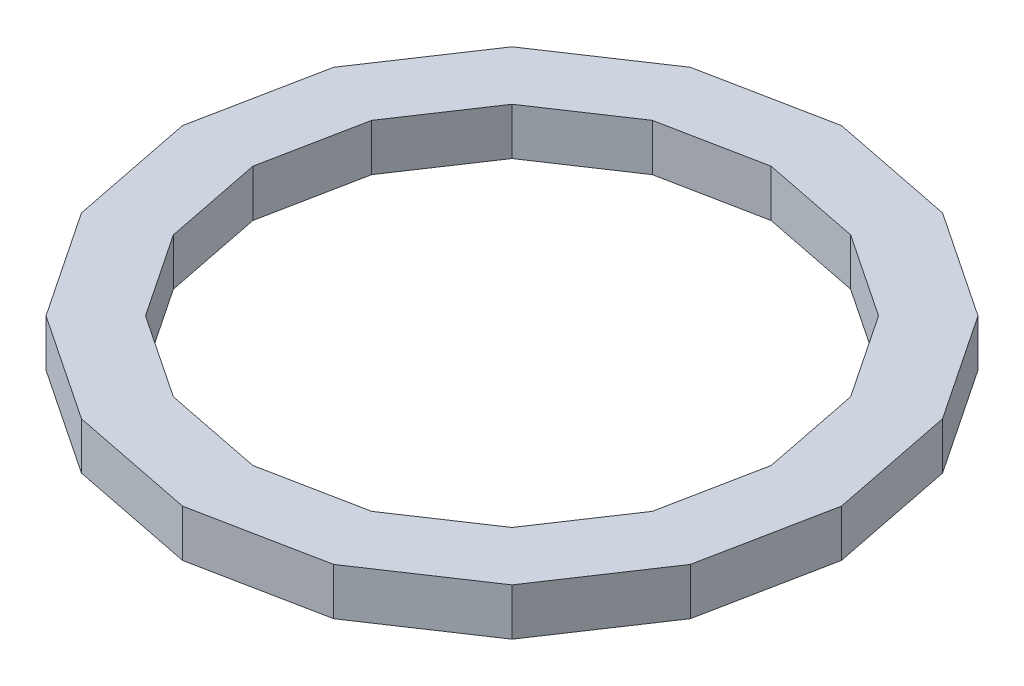
ISO-10303-21;
HEADER;
FILE_DESCRIPTION(('STEP AP214'),'2;1');
FILE_NAME('part.step','',(''),(''),'','','');
FILE_SCHEMA(('AUTOMOTIVE_DESIGN { 1 0 10303 214 1 1 1 1 }'));
ENDSEC;
DATA;
#1=APPLICATION_CONTEXT('core data for automotive mechanical design processes');
#2=APPLICATION_PROTOCOL_DEFINITION('international standard','automotive_design',2000,#1);
#3=PRODUCT_CONTEXT('',#1,'mechanical');
#4=PRODUCT('Part','Part','',(#3));
#5=PRODUCT_RELATED_PRODUCT_CATEGORY('part','',(#4));
#6=PRODUCT_DEFINITION_FORMATION('','',#4);
#7=PRODUCT_DEFINITION_CONTEXT('part definition',#1,'design');
#8=PRODUCT_DEFINITION('design','',#6,#7);
#9=PRODUCT_DEFINITION_SHAPE('','',#8);
#10=(LENGTH_UNIT() NAMED_UNIT(*) SI_UNIT(.MILLI.,.METRE.));
#11=(NAMED_UNIT(*) PLANE_ANGLE_UNIT() SI_UNIT($,.RADIAN.));
#12=(NAMED_UNIT(*) SI_UNIT($,.STERADIAN.) SOLID_ANGLE_UNIT());
#13=UNCERTAINTY_MEASURE_WITH_UNIT(LENGTH_MEASURE(1.E-05),#10,'distance_accuracy_value','');
#14=(GEOMETRIC_REPRESENTATION_CONTEXT(3) GLOBAL_UNCERTAINTY_ASSIGNED_CONTEXT((#13)) GLOBAL_UNIT_ASSIGNED_CONTEXT((#10,
#11,#12)) REPRESENTATION_CONTEXT('',''));
#15=CARTESIAN_POINT('',(0.,0.,0.));
#16=DIRECTION('',(0.,0.,1.));
#17=DIRECTION('',(1.,0.,0.));
#18=AXIS2_PLACEMENT_3D('',#15,#16,#17);
#19=CARTESIAN_POINT('',(0.,19.05,0.));
#20=DIRECTION('',(0.,1.,0.));
#21=DIRECTION('',(0.,0.,1.));
#22=AXIS2_PLACEMENT_3D('',#19,#20,#21);
#23=PLANE('',#22);
#24=DIRECTION('',(0.195090322016116,0.,-0.980785280403233));
#25=VECTOR('',#24,1.);
#26=CARTESIAN_POINT('',(123.292654296521,19.05,51.0694895505947));
#27=LINE('',#26,#25);
#28=CARTESIAN_POINT('',(123.292654296521,19.05,51.0694895505947));
#29=VERTEX_POINT('',#28);
#30=CARTESIAN_POINT('',(133.4510073639,19.05,-1.65839307482374E-12));
#31=VERTEX_POINT('',#30);
#32=EDGE_CURVE('E377',#29,#31,#27,.T.);
#33=ORIENTED_EDGE('',*,*,#32,.T.);
#34=DIRECTION('',(-0.19509032201614,0.,-0.980785280403228));
#35=VECTOR('',#34,1.);
#36=CARTESIAN_POINT('',(133.4510073639,19.05,-1.65839307482374E-12));
#37=LINE('',#36,#35);
#38=CARTESIAN_POINT('',(123.29265429652,19.05,-51.0694895505977));
#39=VERTEX_POINT('',#38);
#40=EDGE_CURVE('E380',#31,#39,#37,.T.);
#41=ORIENTED_EDGE('',*,*,#40,.T.);
#42=DIRECTION('',(-0.555570233019613,0.,-0.831469612302538));
#43=VECTOR('',#42,1.);
#44=CARTESIAN_POINT('',(123.29265429652,19.05,-51.0694895505977));
#45=LINE('',#44,#43);
#46=CARTESIAN_POINT('',(94.3641122631886,19.05,-94.364112263191));
#47=VERTEX_POINT('',#46);
#48=EDGE_CURVE('E383',#39,#47,#45,.T.);
#49=ORIENTED_EDGE('',*,*,#48,.T.);
#50=DIRECTION('',(-0.831469612302552,0.,-0.555570233019592));
#51=VECTOR('',#50,1.);
#52=CARTESIAN_POINT('',(94.3641122631886,19.05,-94.364112263191));
#53=LINE('',#52,#51);
#54=CARTESIAN_POINT('',(51.0694895505949,19.05,-123.292654296521));
#55=VERTEX_POINT('',#54);
#56=EDGE_CURVE('E385',#47,#55,#53,.T.);
#57=ORIENTED_EDGE('',*,*,#56,.T.);
#58=DIRECTION('',(-0.980785280403233,0.,-0.195090322016116));
#59=VECTOR('',#58,1.);
#60=CARTESIAN_POINT('',(51.0694895505949,19.05,-123.292654296521));
#61=LINE('',#60,#59);
#62=CARTESIAN_POINT('',(-1.72280805267142E-12,19.05,-133.4510073639));
#63=VERTEX_POINT('',#62);
#64=EDGE_CURVE('E387',#55,#63,#61,.T.);
#65=ORIENTED_EDGE('',*,*,#64,.T.);
#66=DIRECTION('',(-0.980785280403228,0.,0.19509032201614));
#67=VECTOR('',#66,1.);
#68=CARTESIAN_POINT('',(-1.72280805267142E-12,19.05,-133.4510073639));
#69=LINE('',#68,#67);
#70=CARTESIAN_POINT('',(-51.0694895505977,19.05,-123.29265429652));
#71=VERTEX_POINT('',#70);
#72=EDGE_CURVE('E389',#63,#71,#69,.T.);
#73=ORIENTED_EDGE('',*,*,#72,.T.);
#74=DIRECTION('',(-0.831469612302538,0.,0.555570233019613));
#75=VECTOR('',#74,1.);
#76=CARTESIAN_POINT('',(-51.0694895505977,19.05,-123.29265429652));
#77=LINE('',#76,#75);
#78=CARTESIAN_POINT('',(-94.3641122631909,19.05,-94.3641122631885));
#79=VERTEX_POINT('',#78);
#80=EDGE_CURVE('E391',#71,#79,#77,.T.);
#81=ORIENTED_EDGE('',*,*,#80,.T.);
#82=DIRECTION('',(-0.555570233019592,0.,0.831469612302552));
#83=VECTOR('',#82,1.);
#84=CARTESIAN_POINT('',(-94.3641122631909,19.05,-94.3641122631885));
#85=LINE('',#84,#83);
#86=CARTESIAN_POINT('',(-123.292654296521,19.05,-51.0694895505946));
#87=VERTEX_POINT('',#86);
#88=EDGE_CURVE('E394',#79,#87,#85,.T.);
#89=ORIENTED_EDGE('',*,*,#88,.T.);
#90=DIRECTION('',(-0.195090322016116,0.,0.980785280403233));
#91=VECTOR('',#90,1.);
#92=CARTESIAN_POINT('',(-123.292654296521,19.05,-51.0694895505946));
#93=LINE('',#92,#91);
#94=CARTESIAN_POINT('',(-133.4510073639,19.05,1.73336623719585E-12));
#95=VERTEX_POINT('',#94);
#96=EDGE_CURVE('E397',#87,#95,#93,.T.);
#97=ORIENTED_EDGE('',*,*,#96,.T.);
#98=DIRECTION('',(0.19509032201614,0.,0.980785280403228));
#99=VECTOR('',#98,1.);
#100=CARTESIAN_POINT('',(-133.4510073639,19.05,1.73336623719585E-12));
#101=LINE('',#100,#99);
#102=CARTESIAN_POINT('',(-123.29265429652,19.05,51.0694895505977));
#103=VERTEX_POINT('',#102);
#104=EDGE_CURVE('E399',#95,#103,#101,.T.);
#105=ORIENTED_EDGE('',*,*,#104,.T.);
#106=DIRECTION('',(0.555570233019613,0.,0.831469612302538));
#107=VECTOR('',#106,1.);
#108=CARTESIAN_POINT('',(-123.29265429652,19.05,51.0694895505977));
#109=LINE('',#108,#107);
#110=CARTESIAN_POINT('',(-94.3641122631885,19.05,94.364112263191));
#111=VERTEX_POINT('',#110);
#112=EDGE_CURVE('E401',#103,#111,#109,.T.);
#113=ORIENTED_EDGE('',*,*,#112,.T.);
#114=DIRECTION('',(0.831469612302552,0.,0.555570233019592));
#115=VECTOR('',#114,1.);
#116=CARTESIAN_POINT('',(-94.3641122631885,19.05,94.364112263191));
#117=LINE('',#116,#115);
#118=CARTESIAN_POINT('',(-51.0694895505946,19.05,123.292654296521));
#119=VERTEX_POINT('',#118);
#120=EDGE_CURVE('E404',#111,#119,#117,.T.);
#121=ORIENTED_EDGE('',*,*,#120,.T.);
#122=DIRECTION('',(0.980785280403233,0.,0.195090322016116));
#123=VECTOR('',#122,1.);
#124=CARTESIAN_POINT('',(-51.0694895505946,19.05,123.292654296521));
#125=LINE('',#124,#123);
#126=CARTESIAN_POINT('',(1.54385879686101E-12,19.05,133.4510073639));
#127=VERTEX_POINT('',#126);
#128=EDGE_CURVE('E407',#119,#127,#125,.T.);
#129=ORIENTED_EDGE('',*,*,#128,.T.);
#130=DIRECTION('',(0.980785280403228,0.,-0.19509032201614));
#131=VECTOR('',#130,1.);
#132=CARTESIAN_POINT('',(1.54385879686101E-12,19.05,133.4510073639));
#133=LINE('',#132,#131);
#134=CARTESIAN_POINT('',(51.0694895505977,19.05,123.29265429652));
#135=VERTEX_POINT('',#134);
#136=EDGE_CURVE('E409',#127,#135,#133,.T.);
#137=ORIENTED_EDGE('',*,*,#136,.T.);
#138=DIRECTION('',(0.831469612302538,0.,-0.555570233019613));
#139=VECTOR('',#138,1.);
#140=CARTESIAN_POINT('',(51.0694895505977,19.05,123.29265429652));
#141=LINE('',#140,#139);
#142=CARTESIAN_POINT('',(94.364112263191,19.05,94.3641122631886));
#143=VERTEX_POINT('',#142);
#144=EDGE_CURVE('E412',#135,#143,#141,.T.);
#145=ORIENTED_EDGE('',*,*,#144,.T.);
#146=DIRECTION('',(0.555570233019592,0.,-0.831469612302552));
#147=VECTOR('',#146,1.);
#148=CARTESIAN_POINT('',(94.364112263191,19.05,94.3641122631886));
#149=LINE('',#148,#147);
#150=EDGE_CURVE('E415',#143,#29,#149,.T.);
#151=ORIENTED_EDGE('',*,*,#150,.T.);
#152=EDGE_LOOP('',(#33,#41,#49,#57,#65,#73,#81,#89,#97,#105,#113,#121,#129,#137,#145,#151));
#153=FACE_BOUND('',#152,.T.);
#154=DIRECTION('',(-0.195090322016141,0.,-0.980785280403228));
#155=VECTOR('',#154,1.);
#156=CARTESIAN_POINT('',(104.96363040356,19.05,-1.31875464243097E-12));
#157=LINE('',#156,#155);
#158=CARTESIAN_POINT('',(104.96363040356,19.05,-1.31875464243097E-12));
#159=VERTEX_POINT('',#158);
#160=CARTESIAN_POINT('',(96.9737497879278,19.05,-40.1678423563362));
#161=VERTEX_POINT('',#160);
#162=EDGE_CURVE('E252',#159,#161,#157,.T.);
#163=ORIENTED_EDGE('',*,*,#162,.F.);
#164=DIRECTION('',(0.195090322016116,0.,-0.980785280403233));
#165=VECTOR('',#164,1.);
#166=CARTESIAN_POINT('',(96.9737497879289,19.05,40.1678423563337));
#167=LINE('',#166,#165);
#168=CARTESIAN_POINT('',(96.9737497879289,19.05,40.1678423563337));
#169=VERTEX_POINT('',#168);
#170=EDGE_CURVE('E243',#169,#159,#167,.T.);
#171=ORIENTED_EDGE('',*,*,#170,.F.);
#172=DIRECTION('',(0.555570233019592,0.,-0.831469612302552));
#173=VECTOR('',#172,1.);
#174=CARTESIAN_POINT('',(74.2204948363166,19.05,74.2204948363147));
#175=LINE('',#174,#173);
#176=CARTESIAN_POINT('',(74.2204948363166,19.05,74.2204948363147));
#177=VERTEX_POINT('',#176);
#178=EDGE_CURVE('E299',#177,#169,#175,.T.);
#179=ORIENTED_EDGE('',*,*,#178,.F.);
#180=DIRECTION('',(0.831469612302538,0.,-0.555570233019613));
#181=VECTOR('',#180,1.);
#182=CARTESIAN_POINT('',(40.1678423563362,19.05,96.9737497879278));
#183=LINE('',#182,#181);
#184=CARTESIAN_POINT('',(40.1678423563362,19.05,96.9737497879278));
#185=VERTEX_POINT('',#184);
#186=EDGE_CURVE('E297',#185,#177,#183,.T.);
#187=ORIENTED_EDGE('',*,*,#186,.F.);
#188=DIRECTION('',(0.980785280403228,0.,-0.195090322016141));
#189=VECTOR('',#188,1.);
#190=CARTESIAN_POINT('',(1.31001673253424E-12,19.05,104.96363040356));
#191=LINE('',#190,#189);
#192=CARTESIAN_POINT('',(1.31001673253424E-12,19.05,104.96363040356));
#193=VERTEX_POINT('',#192);
#194=EDGE_CURVE('E295',#193,#185,#191,.T.);
#195=ORIENTED_EDGE('',*,*,#194,.F.);
#196=DIRECTION('',(0.980785280403233,0.,0.195090322016116));
#197=VECTOR('',#196,1.);
#198=CARTESIAN_POINT('',(-40.1678423563337,19.05,96.9737497879288));
#199=LINE('',#198,#197);
#200=CARTESIAN_POINT('',(-40.1678423563337,19.05,96.9737497879288));
#201=VERTEX_POINT('',#200);
#202=EDGE_CURVE('E293',#201,#193,#199,.T.);
#203=ORIENTED_EDGE('',*,*,#202,.F.);
#204=DIRECTION('',(0.831469612302552,0.,0.555570233019591));
#205=VECTOR('',#204,1.);
#206=CARTESIAN_POINT('',(-74.2204948363146,19.05,74.2204948363166));
#207=LINE('',#206,#205);
#208=CARTESIAN_POINT('',(-74.2204948363146,19.05,74.2204948363166));
#209=VERTEX_POINT('',#208);
#210=EDGE_CURVE('E291',#209,#201,#207,.T.);
#211=ORIENTED_EDGE('',*,*,#210,.F.);
#212=DIRECTION('',(0.555570233019613,0.,0.831469612302538));
#213=VECTOR('',#212,1.);
#214=CARTESIAN_POINT('',(-96.9737497879278,19.05,40.1678423563362));
#215=LINE('',#214,#213);
#216=CARTESIAN_POINT('',(-96.9737497879278,19.05,40.1678423563362));
#217=VERTEX_POINT('',#216);
#218=EDGE_CURVE('E289',#217,#209,#215,.T.);
#219=ORIENTED_EDGE('',*,*,#218,.F.);
#220=DIRECTION('',(0.195090322016141,0.,0.980785280403228));
#221=VECTOR('',#220,1.);
#222=CARTESIAN_POINT('',(-104.96363040356,19.05,1.36724501903771E-12));
#223=LINE('',#222,#221);
#224=CARTESIAN_POINT('',(-104.96363040356,19.05,1.36724501903771E-12));
#225=VERTEX_POINT('',#224);
#226=EDGE_CURVE('E287',#225,#217,#223,.T.);
#227=ORIENTED_EDGE('',*,*,#226,.F.);
#228=DIRECTION('',(-0.195090322016116,0.,0.980785280403233));
#229=VECTOR('',#228,1.);
#230=CARTESIAN_POINT('',(-96.9737497879288,19.05,-40.1678423563337));
#231=LINE('',#230,#229);
#232=CARTESIAN_POINT('',(-96.9737497879288,19.05,-40.1678423563337));
#233=VERTEX_POINT('',#232);
#234=EDGE_CURVE('E284',#233,#225,#231,.T.);
#235=ORIENTED_EDGE('',*,*,#234,.F.);
#236=DIRECTION('',(-0.555570233019592,0.,0.831469612302552));
#237=VECTOR('',#236,1.);
#238=CARTESIAN_POINT('',(-74.2204948363166,19.05,-74.2204948363146));
#239=LINE('',#238,#237);
#240=CARTESIAN_POINT('',(-74.2204948363166,19.05,-74.2204948363146));
#241=VERTEX_POINT('',#240);
#242=EDGE_CURVE('E281',#241,#233,#239,.T.);
#243=ORIENTED_EDGE('',*,*,#242,.F.);
#244=DIRECTION('',(-0.831469612302538,0.,0.555570233019613));
#245=VECTOR('',#244,1.);
#246=CARTESIAN_POINT('',(-40.1678423563362,19.05,-96.9737497879278));
#247=LINE('',#246,#245);
#248=CARTESIAN_POINT('',(-40.1678423563362,19.05,-96.9737497879278));
#249=VERTEX_POINT('',#248);
#250=EDGE_CURVE('E279',#249,#241,#247,.T.);
#251=ORIENTED_EDGE('',*,*,#250,.F.);
#252=DIRECTION('',(-0.980785280403228,0.,0.195090322016141));
#253=VECTOR('',#252,1.);
#254=CARTESIAN_POINT('',(-1.3189316094539E-12,19.05,-104.96363040356));
#255=LINE('',#254,#253);
#256=CARTESIAN_POINT('',(-1.3189316094539E-12,19.05,-104.96363040356));
#257=VERTEX_POINT('',#256);
#258=EDGE_CURVE('E277',#257,#249,#255,.T.);
#259=ORIENTED_EDGE('',*,*,#258,.F.);
#260=DIRECTION('',(-0.980785280403233,0.,-0.195090322016116));
#261=VECTOR('',#260,1.);
#262=CARTESIAN_POINT('',(40.1678423563338,19.05,-96.9737497879288));
#263=LINE('',#262,#261);
#264=CARTESIAN_POINT('',(40.1678423563338,19.05,-96.9737497879288));
#265=VERTEX_POINT('',#264);
#266=EDGE_CURVE('E275',#265,#257,#263,.T.);
#267=ORIENTED_EDGE('',*,*,#266,.F.);
#268=DIRECTION('',(-0.831469612302553,0.,-0.555570233019591));
#269=VECTOR('',#268,1.);
#270=CARTESIAN_POINT('',(74.2204948363147,19.05,-74.2204948363166));
#271=LINE('',#270,#269);
#272=CARTESIAN_POINT('',(74.2204948363147,19.05,-74.2204948363166));
#273=VERTEX_POINT('',#272);
#274=EDGE_CURVE('E271',#273,#265,#271,.T.);
#275=ORIENTED_EDGE('',*,*,#274,.F.);
#276=DIRECTION('',(-0.555570233019613,0.,-0.831469612302538));
#277=VECTOR('',#276,1.);
#278=CARTESIAN_POINT('',(96.9737497879278,19.05,-40.1678423563362));
#279=LINE('',#278,#277);
#280=EDGE_CURVE('E265',#161,#273,#279,.T.);
#281=ORIENTED_EDGE('',*,*,#280,.F.);
#282=EDGE_LOOP('',(#163,#171,#179,#187,#195,#203,#211,#219,#227,#235,#243,#251,#259,#267,#275,#281));
#283=FACE_BOUND('',#282,.T.);
#284=ADVANCED_FACE('F34',(#153,#283),#23,.T.);
#285=CARTESIAN_POINT('',(0.,0.,0.));
#286=DIRECTION('',(0.,1.,0.));
#287=DIRECTION('',(0.,0.,1.));
#288=AXIS2_PLACEMENT_3D('',#285,#286,#287);
#289=PLANE('',#288);
#290=DIRECTION('',(0.195090322016116,0.,-0.980785280403233));
#291=VECTOR('',#290,1.);
#292=CARTESIAN_POINT('',(123.292654296521,0.,51.0694895505947));
#293=LINE('',#292,#291);
#294=CARTESIAN_POINT('',(123.292654296521,0.,51.0694895505947));
#295=VERTEX_POINT('',#294);
#296=CARTESIAN_POINT('',(133.4510073639,0.,-1.65839307482374E-12));
#297=VERTEX_POINT('',#296);
#298=EDGE_CURVE('E260',#295,#297,#293,.T.);
#299=ORIENTED_EDGE('',*,*,#298,.F.);
#300=DIRECTION('',(0.555570233019592,0.,-0.831469612302552));
#301=VECTOR('',#300,1.);
#302=CARTESIAN_POINT('',(94.364112263191,0.,94.3641122631886));
#303=LINE('',#302,#301);
#304=CARTESIAN_POINT('',(94.364112263191,0.,94.3641122631886));
#305=VERTEX_POINT('',#304);
#306=EDGE_CURVE('E381',#305,#295,#303,.T.);
#307=ORIENTED_EDGE('',*,*,#306,.F.);
#308=DIRECTION('',(0.831469612302538,0.,-0.555570233019613));
#309=VECTOR('',#308,1.);
#310=CARTESIAN_POINT('',(51.0694895505977,0.,123.29265429652));
#311=LINE('',#310,#309);
#312=CARTESIAN_POINT('',(51.0694895505977,0.,123.29265429652));
#313=VERTEX_POINT('',#312);
#314=EDGE_CURVE('E449',#313,#305,#311,.T.);
#315=ORIENTED_EDGE('',*,*,#314,.F.);
#316=DIRECTION('',(0.980785280403228,0.,-0.19509032201614));
#317=VECTOR('',#316,1.);
#318=CARTESIAN_POINT('',(1.54385879686101E-12,0.,133.4510073639));
#319=LINE('',#318,#317);
#320=CARTESIAN_POINT('',(1.54385879686101E-12,0.,133.4510073639));
#321=VERTEX_POINT('',#320);
#322=EDGE_CURVE('E446',#321,#313,#319,.T.);
#323=ORIENTED_EDGE('',*,*,#322,.F.);
#324=DIRECTION('',(0.980785280403233,0.,0.195090322016116));
#325=VECTOR('',#324,1.);
#326=CARTESIAN_POINT('',(-51.0694895505946,0.,123.292654296521));
#327=LINE('',#326,#325);
#328=CARTESIAN_POINT('',(-51.0694895505946,0.,123.292654296521));
#329=VERTEX_POINT('',#328);
#330=EDGE_CURVE('E443',#329,#321,#327,.T.);
#331=ORIENTED_EDGE('',*,*,#330,.F.);
#332=DIRECTION('',(0.831469612302552,0.,0.555570233019592));
#333=VECTOR('',#332,1.);
#334=CARTESIAN_POINT('',(-94.3641122631885,0.,94.364112263191));
#335=LINE('',#334,#333);
#336=CARTESIAN_POINT('',(-94.3641122631885,0.,94.364112263191));
#337=VERTEX_POINT('',#336);
#338=EDGE_CURVE('E440',#337,#329,#335,.T.);
#339=ORIENTED_EDGE('',*,*,#338,.F.);
#340=DIRECTION('',(0.555570233019613,0.,0.831469612302538));
#341=VECTOR('',#340,1.);
#342=CARTESIAN_POINT('',(-123.29265429652,0.,51.0694895505977));
#343=LINE('',#342,#341);
#344=CARTESIAN_POINT('',(-123.29265429652,0.,51.0694895505977));
#345=VERTEX_POINT('',#344);
#346=EDGE_CURVE('E438',#345,#337,#343,.T.);
#347=ORIENTED_EDGE('',*,*,#346,.F.);
#348=DIRECTION('',(0.19509032201614,0.,0.980785280403228));
#349=VECTOR('',#348,1.);
#350=CARTESIAN_POINT('',(-133.4510073639,0.,1.73336623719585E-12));
#351=LINE('',#350,#349);
#352=CARTESIAN_POINT('',(-133.4510073639,0.,1.73336623719585E-12));
#353=VERTEX_POINT('',#352);
#354=EDGE_CURVE('E436',#353,#345,#351,.T.);
#355=ORIENTED_EDGE('',*,*,#354,.F.);
#356=DIRECTION('',(-0.195090322016116,0.,0.980785280403233));
#357=VECTOR('',#356,1.);
#358=CARTESIAN_POINT('',(-123.292654296521,0.,-51.0694895505946));
#359=LINE('',#358,#357);
#360=CARTESIAN_POINT('',(-123.292654296521,0.,-51.0694895505946));
#361=VERTEX_POINT('',#360);
#362=EDGE_CURVE('E434',#361,#353,#359,.T.);
#363=ORIENTED_EDGE('',*,*,#362,.F.);
#364=DIRECTION('',(-0.555570233019592,0.,0.831469612302552));
#365=VECTOR('',#364,1.);
#366=CARTESIAN_POINT('',(-94.3641122631909,0.,-94.3641122631885));
#367=LINE('',#366,#365);
#368=CARTESIAN_POINT('',(-94.3641122631909,0.,-94.3641122631885));
#369=VERTEX_POINT('',#368);
#370=EDGE_CURVE('E432',#369,#361,#367,.T.);
#371=ORIENTED_EDGE('',*,*,#370,.F.);
#372=DIRECTION('',(-0.831469612302538,0.,0.555570233019613));
#373=VECTOR('',#372,1.);
#374=CARTESIAN_POINT('',(-51.0694895505977,0.,-123.29265429652));
#375=LINE('',#374,#373);
#376=CARTESIAN_POINT('',(-51.0694895505977,0.,-123.29265429652));
#377=VERTEX_POINT('',#376);
#378=EDGE_CURVE('E430',#377,#369,#375,.T.);
#379=ORIENTED_EDGE('',*,*,#378,.F.);
#380=DIRECTION('',(-0.980785280403228,0.,0.19509032201614));
#381=VECTOR('',#380,1.);
#382=CARTESIAN_POINT('',(-1.72280805267142E-12,0.,-133.4510073639));
#383=LINE('',#382,#381);
#384=CARTESIAN_POINT('',(-1.72280805267142E-12,0.,-133.4510073639));
#385=VERTEX_POINT('',#384);
#386=EDGE_CURVE('E428',#385,#377,#383,.T.);
#387=ORIENTED_EDGE('',*,*,#386,.F.);
#388=DIRECTION('',(-0.980785280403233,0.,-0.195090322016116));
#389=VECTOR('',#388,1.);
#390=CARTESIAN_POINT('',(51.0694895505949,0.,-123.292654296521));
#391=LINE('',#390,#389);
#392=CARTESIAN_POINT('',(51.0694895505949,0.,-123.292654296521));
#393=VERTEX_POINT('',#392);
#394=EDGE_CURVE('E426',#393,#385,#391,.T.);
#395=ORIENTED_EDGE('',*,*,#394,.F.);
#396=DIRECTION('',(-0.831469612302552,0.,-0.555570233019592));
#397=VECTOR('',#396,1.);
#398=CARTESIAN_POINT('',(94.3641122631886,0.,-94.364112263191));
#399=LINE('',#398,#397);
#400=CARTESIAN_POINT('',(94.3641122631886,0.,-94.364112263191));
#401=VERTEX_POINT('',#400);
#402=EDGE_CURVE('E424',#401,#393,#399,.T.);
#403=ORIENTED_EDGE('',*,*,#402,.F.);
#404=DIRECTION('',(-0.555570233019613,0.,-0.831469612302538));
#405=VECTOR('',#404,1.);
#406=CARTESIAN_POINT('',(123.29265429652,0.,-51.0694895505977));
#407=LINE('',#406,#405);
#408=CARTESIAN_POINT('',(123.29265429652,0.,-51.0694895505977));
#409=VERTEX_POINT('',#408);
#410=EDGE_CURVE('E422',#409,#401,#407,.T.);
#411=ORIENTED_EDGE('',*,*,#410,.F.);
#412=DIRECTION('',(-0.19509032201614,0.,-0.980785280403228));
#413=VECTOR('',#412,1.);
#414=CARTESIAN_POINT('',(133.4510073639,0.,-1.65839307482374E-12));
#415=LINE('',#414,#413);
#416=EDGE_CURVE('E420',#297,#409,#415,.T.);
#417=ORIENTED_EDGE('',*,*,#416,.F.);
#418=EDGE_LOOP('',(#299,#307,#315,#323,#331,#339,#347,#355,#363,#371,#379,#387,#395,#403,#411,#417));
#419=FACE_BOUND('',#418,.T.);
#420=DIRECTION('',(0.195090322016116,0.,-0.980785280403233));
#421=VECTOR('',#420,1.);
#422=CARTESIAN_POINT('',(96.9737497879289,0.,40.1678423563337));
#423=LINE('',#422,#421);
#424=CARTESIAN_POINT('',(96.9737497879288,0.,40.1678423563337));
#425=VERTEX_POINT('',#424);
#426=CARTESIAN_POINT('',(104.96363040356,0.,-1.31875464243097E-12));
#427=VERTEX_POINT('',#426);
#428=EDGE_CURVE('E57',#425,#427,#423,.T.);
#429=ORIENTED_EDGE('',*,*,#428,.T.);
#430=DIRECTION('',(-0.195090322016141,0.,-0.980785280403228));
#431=VECTOR('',#430,1.);
#432=CARTESIAN_POINT('',(104.96363040356,0.,-1.31875464243097E-12));
#433=LINE('',#432,#431);
#434=CARTESIAN_POINT('',(96.9737497879278,0.,-40.1678423563362));
#435=VERTEX_POINT('',#434);
#436=EDGE_CURVE('E259',#427,#435,#433,.T.);
#437=ORIENTED_EDGE('',*,*,#436,.T.);
#438=DIRECTION('',(-0.555570233019613,0.,-0.831469612302538));
#439=VECTOR('',#438,1.);
#440=CARTESIAN_POINT('',(96.9737497879278,0.,-40.1678423563362));
#441=LINE('',#440,#439);
#442=CARTESIAN_POINT('',(74.2204948363147,0.,-74.2204948363166));
#443=VERTEX_POINT('',#442);
#444=EDGE_CURVE('E303',#435,#443,#441,.T.);
#445=ORIENTED_EDGE('',*,*,#444,.T.);
#446=DIRECTION('',(-0.831469612302553,0.,-0.555570233019591));
#447=VECTOR('',#446,1.);
#448=CARTESIAN_POINT('',(74.2204948363147,0.,-74.2204948363166));
#449=LINE('',#448,#447);
#450=CARTESIAN_POINT('',(40.1678423563338,0.,-96.9737497879288));
#451=VERTEX_POINT('',#450);
#452=EDGE_CURVE('E306',#443,#451,#449,.T.);
#453=ORIENTED_EDGE('',*,*,#452,.T.);
#454=DIRECTION('',(-0.980785280403233,0.,-0.195090322016116));
#455=VECTOR('',#454,1.);
#456=CARTESIAN_POINT('',(40.1678423563338,0.,-96.9737497879288));
#457=LINE('',#456,#455);
#458=CARTESIAN_POINT('',(-1.3189316094539E-12,0.,-104.96363040356));
#459=VERTEX_POINT('',#458);
#460=EDGE_CURVE('E309',#451,#459,#457,.T.);
#461=ORIENTED_EDGE('',*,*,#460,.T.);
#462=DIRECTION('',(-0.980785280403228,0.,0.195090322016141));
#463=VECTOR('',#462,1.);
#464=CARTESIAN_POINT('',(-1.3189316094539E-12,0.,-104.96363040356));
#465=LINE('',#464,#463);
#466=CARTESIAN_POINT('',(-40.1678423563362,0.,-96.9737497879278));
#467=VERTEX_POINT('',#466);
#468=EDGE_CURVE('E312',#459,#467,#465,.T.);
#469=ORIENTED_EDGE('',*,*,#468,.T.);
#470=DIRECTION('',(-0.831469612302538,0.,0.555570233019613));
#471=VECTOR('',#470,1.);
#472=CARTESIAN_POINT('',(-40.1678423563362,0.,-96.9737497879278));
#473=LINE('',#472,#471);
#474=CARTESIAN_POINT('',(-74.2204948363166,0.,-74.2204948363146));
#475=VERTEX_POINT('',#474);
#476=EDGE_CURVE('E315',#467,#475,#473,.T.);
#477=ORIENTED_EDGE('',*,*,#476,.T.);
#478=DIRECTION('',(-0.555570233019592,0.,0.831469612302552));
#479=VECTOR('',#478,1.);
#480=CARTESIAN_POINT('',(-74.2204948363166,0.,-74.2204948363146));
#481=LINE('',#480,#479);
#482=CARTESIAN_POINT('',(-96.9737497879288,0.,-40.1678423563337));
#483=VERTEX_POINT('',#482);
#484=EDGE_CURVE('E318',#475,#483,#481,.T.);
#485=ORIENTED_EDGE('',*,*,#484,.T.);
#486=DIRECTION('',(-0.195090322016116,0.,0.980785280403233));
#487=VECTOR('',#486,1.);
#488=CARTESIAN_POINT('',(-96.9737497879288,0.,-40.1678423563337));
#489=LINE('',#488,#487);
#490=CARTESIAN_POINT('',(-104.96363040356,0.,1.36724501903771E-12));
#491=VERTEX_POINT('',#490);
#492=EDGE_CURVE('E321',#483,#491,#489,.T.);
#493=ORIENTED_EDGE('',*,*,#492,.T.);
#494=DIRECTION('',(0.195090322016141,0.,0.980785280403228));
#495=VECTOR('',#494,1.);
#496=CARTESIAN_POINT('',(-104.96363040356,0.,1.36724501903771E-12));
#497=LINE('',#496,#495);
#498=CARTESIAN_POINT('',(-96.9737497879278,0.,40.1678423563362));
#499=VERTEX_POINT('',#498);
#500=EDGE_CURVE('E325',#491,#499,#497,.T.);
#501=ORIENTED_EDGE('',*,*,#500,.T.);
#502=DIRECTION('',(0.555570233019613,0.,0.831469612302538));
#503=VECTOR('',#502,1.);
#504=CARTESIAN_POINT('',(-96.9737497879278,0.,40.1678423563362));
#505=LINE('',#504,#503);
#506=CARTESIAN_POINT('',(-74.2204948363146,0.,74.2204948363166));
#507=VERTEX_POINT('',#506);
#508=EDGE_CURVE('E328',#499,#507,#505,.T.);
#509=ORIENTED_EDGE('',*,*,#508,.T.);
#510=DIRECTION('',(0.831469612302552,0.,0.555570233019591));
#511=VECTOR('',#510,1.);
#512=CARTESIAN_POINT('',(-74.2204948363146,0.,74.2204948363166));
#513=LINE('',#512,#511);
#514=CARTESIAN_POINT('',(-40.1678423563337,0.,96.9737497879288));
#515=VERTEX_POINT('',#514);
#516=EDGE_CURVE('E331',#507,#515,#513,.T.);
#517=ORIENTED_EDGE('',*,*,#516,.T.);
#518=DIRECTION('',(0.980785280403233,0.,0.195090322016116));
#519=VECTOR('',#518,1.);
#520=CARTESIAN_POINT('',(-40.1678423563337,0.,96.9737497879288));
#521=LINE('',#520,#519);
#522=CARTESIAN_POINT('',(1.31001673253424E-12,0.,104.96363040356));
#523=VERTEX_POINT('',#522);
#524=EDGE_CURVE('E334',#515,#523,#521,.T.);
#525=ORIENTED_EDGE('',*,*,#524,.T.);
#526=DIRECTION('',(0.980785280403228,0.,-0.195090322016141));
#527=VECTOR('',#526,1.);
#528=CARTESIAN_POINT('',(1.31001673253424E-12,0.,104.96363040356));
#529=LINE('',#528,#527);
#530=CARTESIAN_POINT('',(40.1678423563362,0.,96.9737497879278));
#531=VERTEX_POINT('',#530);
#532=EDGE_CURVE('E337',#523,#531,#529,.T.);
#533=ORIENTED_EDGE('',*,*,#532,.T.);
#534=DIRECTION('',(0.831469612302538,0.,-0.555570233019613));
#535=VECTOR('',#534,1.);
#536=CARTESIAN_POINT('',(40.1678423563362,0.,96.9737497879278));
#537=LINE('',#536,#535);
#538=CARTESIAN_POINT('',(74.2204948363166,0.,74.2204948363147));
#539=VERTEX_POINT('',#538);
#540=EDGE_CURVE('E340',#531,#539,#537,.T.);
#541=ORIENTED_EDGE('',*,*,#540,.T.);
#542=DIRECTION('',(0.555570233019592,0.,-0.831469612302552));
#543=VECTOR('',#542,1.);
#544=CARTESIAN_POINT('',(74.2204948363166,0.,74.2204948363147));
#545=LINE('',#544,#543);
#546=EDGE_CURVE('E253',#539,#425,#545,.T.);
#547=ORIENTED_EDGE('',*,*,#546,.T.);
#548=EDGE_LOOP('',(#429,#437,#445,#453,#461,#469,#477,#485,#493,#501,#509,#517,#525,#533,#541,#547));
#549=FACE_BOUND('',#548,.T.);
#550=ADVANCED_FACE('F506',(#419,#549),#289,.F.);
#551=CARTESIAN_POINT('',(123.292654296521,19.05,51.0694895505947));
#552=DIRECTION('',(-0.980785280403233,0.,-0.195090322016116));
#553=DIRECTION('',(-0.195090322016116,0.,0.980785280403233));
#554=AXIS2_PLACEMENT_3D('',#551,#552,#553);
#555=PLANE('',#554);
#556=ORIENTED_EDGE('',*,*,#298,.T.);
#557=DIRECTION('',(0.,-1.,0.));
#558=VECTOR('',#557,1.);
#559=CARTESIAN_POINT('',(133.4510073639,19.05,-1.65839307482374E-12));
#560=LINE('',#559,#558);
#561=EDGE_CURVE('E11',#31,#297,#560,.T.);
#562=ORIENTED_EDGE('',*,*,#561,.F.);
#563=ORIENTED_EDGE('',*,*,#32,.F.);
#564=DIRECTION('',(0.,-1.,0.));
#565=VECTOR('',#564,1.);
#566=CARTESIAN_POINT('',(123.292654296521,19.05,51.0694895505947));
#567=LINE('',#566,#565);
#568=EDGE_CURVE('E417',#29,#295,#567,.T.);
#569=ORIENTED_EDGE('',*,*,#568,.T.);
#570=EDGE_LOOP('',(#556,#562,#563,#569));
#571=FACE_BOUND('',#570,.T.);
#572=ADVANCED_FACE('F36',(#571),#555,.F.);
#573=CARTESIAN_POINT('',(133.4510073639,19.05,-1.65839307482374E-12));
#574=DIRECTION('',(-0.980785280403228,0.,0.19509032201614));
#575=DIRECTION('',(0.19509032201614,0.,0.980785280403228));
#576=AXIS2_PLACEMENT_3D('',#573,#574,#575);
#577=PLANE('',#576);
#578=ORIENTED_EDGE('',*,*,#416,.T.);
#579=DIRECTION('',(0.,-1.,0.));
#580=VECTOR('',#579,1.);
#581=CARTESIAN_POINT('',(123.29265429652,19.05,-51.0694895505977));
#582=LINE('',#581,#580);
#583=EDGE_CURVE('E42',#39,#409,#582,.T.);
#584=ORIENTED_EDGE('',*,*,#583,.F.);
#585=ORIENTED_EDGE('',*,*,#40,.F.);
#586=ORIENTED_EDGE('',*,*,#561,.T.);
#587=EDGE_LOOP('',(#578,#584,#585,#586));
#588=FACE_BOUND('',#587,.T.);
#589=ADVANCED_FACE('F523',(#588),#577,.F.);
#590=CARTESIAN_POINT('',(123.29265429652,19.05,-51.0694895505977));
#591=DIRECTION('',(-0.831469612302538,0.,0.555570233019613));
#592=DIRECTION('',(0.555570233019613,0.,0.831469612302538));
#593=AXIS2_PLACEMENT_3D('',#590,#591,#592);
#594=PLANE('',#593);
#595=ORIENTED_EDGE('',*,*,#410,.T.);
#596=DIRECTION('',(0.,-1.,0.));
#597=VECTOR('',#596,1.);
#598=CARTESIAN_POINT('',(94.3641122631886,19.05,-94.364112263191));
#599=LINE('',#598,#597);
#600=EDGE_CURVE('E493',#47,#401,#599,.T.);
#601=ORIENTED_EDGE('',*,*,#600,.F.);
#602=ORIENTED_EDGE('',*,*,#48,.F.);
#603=ORIENTED_EDGE('',*,*,#583,.T.);
#604=EDGE_LOOP('',(#595,#601,#602,#603));
#605=FACE_BOUND('',#604,.T.);
#606=ADVANCED_FACE('F500',(#605),#594,.F.);
#607=CARTESIAN_POINT('',(94.3641122631886,19.05,-94.364112263191));
#608=DIRECTION('',(-0.555570233019592,0.,0.831469612302552));
#609=DIRECTION('',(0.831469612302553,0.,0.555570233019592));
#610=AXIS2_PLACEMENT_3D('',#607,#608,#609);
#611=PLANE('',#610);
#612=ORIENTED_EDGE('',*,*,#402,.T.);
#613=DIRECTION('',(0.,-1.,0.));
#614=VECTOR('',#613,1.);
#615=CARTESIAN_POINT('',(51.0694895505949,19.05,-123.292654296521));
#616=LINE('',#615,#614);
#617=EDGE_CURVE('E489',#55,#393,#616,.T.);
#618=ORIENTED_EDGE('',*,*,#617,.F.);
#619=ORIENTED_EDGE('',*,*,#56,.F.);
#620=ORIENTED_EDGE('',*,*,#600,.T.);
#621=EDGE_LOOP('',(#612,#618,#619,#620));
#622=FACE_BOUND('',#621,.T.);
#623=ADVANCED_FACE('F512',(#622),#611,.F.);
#624=CARTESIAN_POINT('',(51.0694895505949,19.05,-123.292654296521));
#625=DIRECTION('',(-0.195090322016116,0.,0.980785280403233));
#626=DIRECTION('',(0.980785280403233,0.,0.195090322016116));
#627=AXIS2_PLACEMENT_3D('',#624,#625,#626);
#628=PLANE('',#627);
#629=ORIENTED_EDGE('',*,*,#394,.T.);
#630=DIRECTION('',(0.,-1.,0.));
#631=VECTOR('',#630,1.);
#632=CARTESIAN_POINT('',(-1.72280805267142E-12,19.05,-133.4510073639));
#633=LINE('',#632,#631);
#634=EDGE_CURVE('E485',#63,#385,#633,.T.);
#635=ORIENTED_EDGE('',*,*,#634,.F.);
#636=ORIENTED_EDGE('',*,*,#64,.F.);
#637=ORIENTED_EDGE('',*,*,#617,.T.);
#638=EDGE_LOOP('',(#629,#635,#636,#637));
#639=FACE_BOUND('',#638,.T.);
#640=ADVANCED_FACE('F516',(#639),#628,.F.);
#641=CARTESIAN_POINT('',(-1.72280805267142E-12,19.05,-133.4510073639));
#642=DIRECTION('',(0.19509032201614,0.,0.980785280403228));
#643=DIRECTION('',(0.980785280403228,0.,-0.19509032201614));
#644=AXIS2_PLACEMENT_3D('',#641,#642,#643);
#645=PLANE('',#644);
#646=ORIENTED_EDGE('',*,*,#386,.T.);
#647=DIRECTION('',(0.,-1.,0.));
#648=VECTOR('',#647,1.);
#649=CARTESIAN_POINT('',(-51.0694895505977,19.05,-123.29265429652));
#650=LINE('',#649,#648);
#651=EDGE_CURVE('E482',#71,#377,#650,.T.);
#652=ORIENTED_EDGE('',*,*,#651,.F.);
#653=ORIENTED_EDGE('',*,*,#72,.F.);
#654=ORIENTED_EDGE('',*,*,#634,.T.);
#655=EDGE_LOOP('',(#646,#652,#653,#654));
#656=FACE_BOUND('',#655,.T.);
#657=ADVANCED_FACE('F576',(#656),#645,.F.);
#658=CARTESIAN_POINT('',(-51.0694895505977,19.05,-123.29265429652));
#659=DIRECTION('',(0.555570233019613,0.,0.831469612302538));
#660=DIRECTION('',(0.831469612302538,0.,-0.555570233019613));
#661=AXIS2_PLACEMENT_3D('',#658,#659,#660);
#662=PLANE('',#661);
#663=ORIENTED_EDGE('',*,*,#378,.T.);
#664=DIRECTION('',(0.,-1.,0.));
#665=VECTOR('',#664,1.);
#666=CARTESIAN_POINT('',(-94.3641122631909,19.05,-94.3641122631885));
#667=LINE('',#666,#665);
#668=EDGE_CURVE('E479',#79,#369,#667,.T.);
#669=ORIENTED_EDGE('',*,*,#668,.F.);
#670=ORIENTED_EDGE('',*,*,#80,.F.);
#671=ORIENTED_EDGE('',*,*,#651,.T.);
#672=EDGE_LOOP('',(#663,#669,#670,#671));
#673=FACE_BOUND('',#672,.T.);
#674=ADVANCED_FACE('F573',(#673),#662,.F.);
#675=CARTESIAN_POINT('',(-94.3641122631909,19.05,-94.3641122631885));
#676=DIRECTION('',(0.831469612302552,0.,0.555570233019592));
#677=DIRECTION('',(0.555570233019592,0.,-0.831469612302552));
#678=AXIS2_PLACEMENT_3D('',#675,#676,#677);
#679=PLANE('',#678);
#680=ORIENTED_EDGE('',*,*,#370,.T.);
#681=DIRECTION('',(0.,-1.,0.));
#682=VECTOR('',#681,1.);
#683=CARTESIAN_POINT('',(-123.292654296521,19.05,-51.0694895505946));
#684=LINE('',#683,#682);
#685=EDGE_CURVE('E476',#87,#361,#684,.T.);
#686=ORIENTED_EDGE('',*,*,#685,.F.);
#687=ORIENTED_EDGE('',*,*,#88,.F.);
#688=ORIENTED_EDGE('',*,*,#668,.T.);
#689=EDGE_LOOP('',(#680,#686,#687,#688));
#690=FACE_BOUND('',#689,.T.);
#691=ADVANCED_FACE('F569',(#690),#679,.F.);
#692=CARTESIAN_POINT('',(-123.292654296521,19.05,-51.0694895505946));
#693=DIRECTION('',(0.980785280403233,0.,0.195090322016116));
#694=DIRECTION('',(0.195090322016116,0.,-0.980785280403233));
#695=AXIS2_PLACEMENT_3D('',#692,#693,#694);
#696=PLANE('',#695);
#697=ORIENTED_EDGE('',*,*,#362,.T.);
#698=DIRECTION('',(0.,-1.,0.));
#699=VECTOR('',#698,1.);
#700=CARTESIAN_POINT('',(-133.4510073639,19.05,1.73336623719585E-12));
#701=LINE('',#700,#699);
#702=EDGE_CURVE('E473',#95,#353,#701,.T.);
#703=ORIENTED_EDGE('',*,*,#702,.F.);
#704=ORIENTED_EDGE('',*,*,#96,.F.);
#705=ORIENTED_EDGE('',*,*,#685,.T.);
#706=EDGE_LOOP('',(#697,#703,#704,#705));
#707=FACE_BOUND('',#706,.T.);
#708=ADVANCED_FACE('F565',(#707),#696,.F.);
#709=CARTESIAN_POINT('',(-133.4510073639,19.05,1.73336623719585E-12));
#710=DIRECTION('',(0.980785280403228,0.,-0.19509032201614));
#711=DIRECTION('',(-0.19509032201614,0.,-0.980785280403228));
#712=AXIS2_PLACEMENT_3D('',#709,#710,#711);
#713=PLANE('',#712);
#714=ORIENTED_EDGE('',*,*,#354,.T.);
#715=DIRECTION('',(0.,-1.,0.));
#716=VECTOR('',#715,1.);
#717=CARTESIAN_POINT('',(-123.29265429652,19.05,51.0694895505977));
#718=LINE('',#717,#716);
#719=EDGE_CURVE('E470',#103,#345,#718,.T.);
#720=ORIENTED_EDGE('',*,*,#719,.F.);
#721=ORIENTED_EDGE('',*,*,#104,.F.);
#722=ORIENTED_EDGE('',*,*,#702,.T.);
#723=EDGE_LOOP('',(#714,#720,#721,#722));
#724=FACE_BOUND('',#723,.T.);
#725=ADVANCED_FACE('F560',(#724),#713,.F.);
#726=CARTESIAN_POINT('',(-123.29265429652,19.05,51.0694895505977));
#727=DIRECTION('',(0.831469612302538,0.,-0.555570233019613));
#728=DIRECTION('',(-0.555570233019613,0.,-0.831469612302538));
#729=AXIS2_PLACEMENT_3D('',#726,#727,#728);
#730=PLANE('',#729);
#731=ORIENTED_EDGE('',*,*,#346,.T.);
#732=DIRECTION('',(0.,-1.,0.));
#733=VECTOR('',#732,1.);
#734=CARTESIAN_POINT('',(-94.3641122631885,19.05,94.364112263191));
#735=LINE('',#734,#733);
#736=EDGE_CURVE('E467',#111,#337,#735,.T.);
#737=ORIENTED_EDGE('',*,*,#736,.F.);
#738=ORIENTED_EDGE('',*,*,#112,.F.);
#739=ORIENTED_EDGE('',*,*,#719,.T.);
#740=EDGE_LOOP('',(#731,#737,#738,#739));
#741=FACE_BOUND('',#740,.T.);
#742=ADVANCED_FACE('F554',(#741),#730,.F.);
#743=CARTESIAN_POINT('',(-94.3641122631885,19.05,94.364112263191));
#744=DIRECTION('',(0.555570233019592,0.,-0.831469612302552));
#745=DIRECTION('',(-0.831469612302552,0.,-0.555570233019592));
#746=AXIS2_PLACEMENT_3D('',#743,#744,#745);
#747=PLANE('',#746);
#748=ORIENTED_EDGE('',*,*,#338,.T.);
#749=DIRECTION('',(0.,-1.,0.));
#750=VECTOR('',#749,1.);
#751=CARTESIAN_POINT('',(-51.0694895505946,19.05,123.292654296521));
#752=LINE('',#751,#750);
#753=EDGE_CURVE('E464',#119,#329,#752,.T.);
#754=ORIENTED_EDGE('',*,*,#753,.F.);
#755=ORIENTED_EDGE('',*,*,#120,.F.);
#756=ORIENTED_EDGE('',*,*,#736,.T.);
#757=EDGE_LOOP('',(#748,#754,#755,#756));
#758=FACE_BOUND('',#757,.T.);
#759=ADVANCED_FACE('F550',(#758),#747,.F.);
#760=CARTESIAN_POINT('',(-51.0694895505946,19.05,123.292654296521));
#761=DIRECTION('',(0.195090322016116,0.,-0.980785280403233));
#762=DIRECTION('',(-0.980785280403233,0.,-0.195090322016116));
#763=AXIS2_PLACEMENT_3D('',#760,#761,#762);
#764=PLANE('',#763);
#765=ORIENTED_EDGE('',*,*,#330,.T.);
#766=DIRECTION('',(0.,-1.,0.));
#767=VECTOR('',#766,1.);
#768=CARTESIAN_POINT('',(1.54385879686101E-12,19.05,133.4510073639));
#769=LINE('',#768,#767);
#770=EDGE_CURVE('E460',#127,#321,#769,.T.);
#771=ORIENTED_EDGE('',*,*,#770,.F.);
#772=ORIENTED_EDGE('',*,*,#128,.F.);
#773=ORIENTED_EDGE('',*,*,#753,.T.);
#774=EDGE_LOOP('',(#765,#771,#772,#773));
#775=FACE_BOUND('',#774,.T.);
#776=ADVANCED_FACE('F545',(#775),#764,.F.);
#777=CARTESIAN_POINT('',(1.54385879686101E-12,19.05,133.4510073639));
#778=DIRECTION('',(-0.19509032201614,0.,-0.980785280403228));
#779=DIRECTION('',(-0.980785280403228,0.,0.19509032201614));
#780=AXIS2_PLACEMENT_3D('',#777,#778,#779);
#781=PLANE('',#780);
#782=ORIENTED_EDGE('',*,*,#322,.T.);
#783=DIRECTION('',(0.,-1.,0.));
#784=VECTOR('',#783,1.);
#785=CARTESIAN_POINT('',(51.0694895505977,19.05,123.29265429652));
#786=LINE('',#785,#784);
#787=EDGE_CURVE('E457',#135,#313,#786,.T.);
#788=ORIENTED_EDGE('',*,*,#787,.F.);
#789=ORIENTED_EDGE('',*,*,#136,.F.);
#790=ORIENTED_EDGE('',*,*,#770,.T.);
#791=EDGE_LOOP('',(#782,#788,#789,#790));
#792=FACE_BOUND('',#791,.T.);
#793=ADVANCED_FACE('F539',(#792),#781,.F.);
#794=CARTESIAN_POINT('',(51.0694895505977,19.05,123.29265429652));
#795=DIRECTION('',(-0.555570233019613,0.,-0.831469612302538));
#796=DIRECTION('',(-0.831469612302538,0.,0.555570233019613));
#797=AXIS2_PLACEMENT_3D('',#794,#795,#796);
#798=PLANE('',#797);
#799=ORIENTED_EDGE('',*,*,#314,.T.);
#800=DIRECTION('',(0.,-1.,0.));
#801=VECTOR('',#800,1.);
#802=CARTESIAN_POINT('',(94.364112263191,19.05,94.3641122631886));
#803=LINE('',#802,#801);
#804=EDGE_CURVE('E454',#143,#305,#803,.T.);
#805=ORIENTED_EDGE('',*,*,#804,.F.);
#806=ORIENTED_EDGE('',*,*,#144,.F.);
#807=ORIENTED_EDGE('',*,*,#787,.T.);
#808=EDGE_LOOP('',(#799,#805,#806,#807));
#809=FACE_BOUND('',#808,.T.);
#810=ADVANCED_FACE('F535',(#809),#798,.F.);
#811=CARTESIAN_POINT('',(94.364112263191,19.05,94.3641122631886));
#812=DIRECTION('',(-0.831469612302552,0.,-0.555570233019592));
#813=DIRECTION('',(-0.555570233019592,0.,0.831469612302552));
#814=AXIS2_PLACEMENT_3D('',#811,#812,#813);
#815=PLANE('',#814);
#816=ORIENTED_EDGE('',*,*,#306,.T.);
#817=ORIENTED_EDGE('',*,*,#568,.F.);
#818=ORIENTED_EDGE('',*,*,#150,.F.);
#819=ORIENTED_EDGE('',*,*,#804,.T.);
#820=EDGE_LOOP('',(#816,#817,#818,#819));
#821=FACE_BOUND('',#820,.T.);
#822=ADVANCED_FACE('F530',(#821),#815,.F.);
#823=CARTESIAN_POINT('',(96.9737497879289,19.05,40.1678423563337));
#824=DIRECTION('',(-0.980785280403233,0.,-0.195090322016116));
#825=DIRECTION('',(-0.195090322016116,0.,0.980785280403233));
#826=AXIS2_PLACEMENT_3D('',#823,#824,#825);
#827=PLANE('',#826);
#828=ORIENTED_EDGE('',*,*,#428,.F.);
#829=DIRECTION('',(0.,-1.,0.));
#830=VECTOR('',#829,1.);
#831=CARTESIAN_POINT('',(96.9737497879289,19.05,40.1678423563337));
#832=LINE('',#831,#830);
#833=EDGE_CURVE('E247',#169,#425,#832,.T.);
#834=ORIENTED_EDGE('',*,*,#833,.F.);
#835=ORIENTED_EDGE('',*,*,#170,.T.);
#836=DIRECTION('',(0.,-1.,0.));
#837=VECTOR('',#836,1.);
#838=CARTESIAN_POINT('',(104.96363040356,19.05,-1.31875464243097E-12));
#839=LINE('',#838,#837);
#840=EDGE_CURVE('E246',#159,#427,#839,.T.);
#841=ORIENTED_EDGE('',*,*,#840,.T.);
#842=EDGE_LOOP('',(#828,#834,#835,#841));
#843=FACE_BOUND('',#842,.T.);
#844=ADVANCED_FACE('F245',(#843),#827,.T.);
#845=CARTESIAN_POINT('',(104.96363040356,19.05,-1.31875464243097E-12));
#846=DIRECTION('',(-0.980785280403228,0.,0.195090322016141));
#847=DIRECTION('',(0.195090322016141,0.,0.980785280403228));
#848=AXIS2_PLACEMENT_3D('',#845,#846,#847);
#849=PLANE('',#848);
#850=ORIENTED_EDGE('',*,*,#436,.F.);
#851=ORIENTED_EDGE('',*,*,#840,.F.);
#852=ORIENTED_EDGE('',*,*,#162,.T.);
#853=DIRECTION('',(0.,-1.,0.));
#854=VECTOR('',#853,1.);
#855=CARTESIAN_POINT('',(96.9737497879278,19.05,-40.1678423563362));
#856=LINE('',#855,#854);
#857=EDGE_CURVE('E261',#161,#435,#856,.T.);
#858=ORIENTED_EDGE('',*,*,#857,.T.);
#859=EDGE_LOOP('',(#850,#851,#852,#858));
#860=FACE_BOUND('',#859,.T.);
#861=ADVANCED_FACE('F256',(#860),#849,.T.);
#862=CARTESIAN_POINT('',(96.9737497879278,19.05,-40.1678423563362));
#863=DIRECTION('',(-0.831469612302538,0.,0.555570233019613));
#864=DIRECTION('',(0.555570233019613,0.,0.831469612302538));
#865=AXIS2_PLACEMENT_3D('',#862,#863,#864);
#866=PLANE('',#865);
#867=ORIENTED_EDGE('',*,*,#444,.F.);
#868=ORIENTED_EDGE('',*,*,#857,.F.);
#869=ORIENTED_EDGE('',*,*,#280,.T.);
#870=DIRECTION('',(0.,-1.,0.));
#871=VECTOR('',#870,1.);
#872=CARTESIAN_POINT('',(74.2204948363147,19.05,-74.2204948363166));
#873=LINE('',#872,#871);
#874=EDGE_CURVE('E374',#273,#443,#873,.T.);
#875=ORIENTED_EDGE('',*,*,#874,.T.);
#876=EDGE_LOOP('',(#867,#868,#869,#875));
#877=FACE_BOUND('',#876,.T.);
#878=ADVANCED_FACE('F658',(#877),#866,.T.);
#879=CARTESIAN_POINT('',(74.2204948363147,19.05,-74.2204948363166));
#880=DIRECTION('',(-0.555570233019591,0.,0.831469612302553));
#881=DIRECTION('',(0.831469612302553,0.,0.555570233019591));
#882=AXIS2_PLACEMENT_3D('',#879,#880,#881);
#883=PLANE('',#882);
#884=ORIENTED_EDGE('',*,*,#452,.F.);
#885=ORIENTED_EDGE('',*,*,#874,.F.);
#886=ORIENTED_EDGE('',*,*,#274,.T.);
#887=DIRECTION('',(0.,-1.,0.));
#888=VECTOR('',#887,1.);
#889=CARTESIAN_POINT('',(40.1678423563338,19.05,-96.9737497879288));
#890=LINE('',#889,#888);
#891=EDGE_CURVE('E372',#265,#451,#890,.T.);
#892=ORIENTED_EDGE('',*,*,#891,.T.);
#893=EDGE_LOOP('',(#884,#885,#886,#892));
#894=FACE_BOUND('',#893,.T.);
#895=ADVANCED_FACE('F664',(#894),#883,.T.);
#896=CARTESIAN_POINT('',(40.1678423563338,19.05,-96.9737497879288));
#897=DIRECTION('',(-0.195090322016116,0.,0.980785280403233));
#898=DIRECTION('',(0.980785280403233,0.,0.195090322016116));
#899=AXIS2_PLACEMENT_3D('',#896,#897,#898);
#900=PLANE('',#899);
#901=ORIENTED_EDGE('',*,*,#460,.F.);
#902=ORIENTED_EDGE('',*,*,#891,.F.);
#903=ORIENTED_EDGE('',*,*,#266,.T.);
#904=DIRECTION('',(0.,-1.,0.));
#905=VECTOR('',#904,1.);
#906=CARTESIAN_POINT('',(-1.3189316094539E-12,19.05,-104.96363040356));
#907=LINE('',#906,#905);
#908=EDGE_CURVE('E369',#257,#459,#907,.T.);
#909=ORIENTED_EDGE('',*,*,#908,.T.);
#910=EDGE_LOOP('',(#901,#902,#903,#909));
#911=FACE_BOUND('',#910,.T.);
#912=ADVANCED_FACE('F672',(#911),#900,.T.);
#913=CARTESIAN_POINT('',(-1.3189316094539E-12,19.05,-104.96363040356));
#914=DIRECTION('',(0.195090322016141,0.,0.980785280403228));
#915=DIRECTION('',(0.980785280403228,0.,-0.195090322016141));
#916=AXIS2_PLACEMENT_3D('',#913,#914,#915);
#917=PLANE('',#916);
#918=ORIENTED_EDGE('',*,*,#468,.F.);
#919=ORIENTED_EDGE('',*,*,#908,.F.);
#920=ORIENTED_EDGE('',*,*,#258,.T.);
#921=DIRECTION('',(0.,-1.,0.));
#922=VECTOR('',#921,1.);
#923=CARTESIAN_POINT('',(-40.1678423563362,19.05,-96.9737497879278));
#924=LINE('',#923,#922);
#925=EDGE_CURVE('E367',#249,#467,#924,.T.);
#926=ORIENTED_EDGE('',*,*,#925,.T.);
#927=EDGE_LOOP('',(#918,#919,#920,#926));
#928=FACE_BOUND('',#927,.T.);
#929=ADVANCED_FACE('F680',(#928),#917,.T.);
#930=CARTESIAN_POINT('',(-40.1678423563362,19.05,-96.9737497879278));
#931=DIRECTION('',(0.555570233019613,0.,0.831469612302538));
#932=DIRECTION('',(0.831469612302538,0.,-0.555570233019613));
#933=AXIS2_PLACEMENT_3D('',#930,#931,#932);
#934=PLANE('',#933);
#935=ORIENTED_EDGE('',*,*,#476,.F.);
#936=ORIENTED_EDGE('',*,*,#925,.F.);
#937=ORIENTED_EDGE('',*,*,#250,.T.);
#938=DIRECTION('',(0.,-1.,0.));
#939=VECTOR('',#938,1.);
#940=CARTESIAN_POINT('',(-74.2204948363166,19.05,-74.2204948363146));
#941=LINE('',#940,#939);
#942=EDGE_CURVE('E364',#241,#475,#941,.T.);
#943=ORIENTED_EDGE('',*,*,#942,.T.);
#944=EDGE_LOOP('',(#935,#936,#937,#943));
#945=FACE_BOUND('',#944,.T.);
#946=ADVANCED_FACE('F688',(#945),#934,.T.);
#947=CARTESIAN_POINT('',(-74.2204948363166,19.05,-74.2204948363146));
#948=DIRECTION('',(0.831469612302552,0.,0.555570233019592));
#949=DIRECTION('',(0.555570233019592,0.,-0.831469612302553));
#950=AXIS2_PLACEMENT_3D('',#947,#948,#949);
#951=PLANE('',#950);
#952=ORIENTED_EDGE('',*,*,#484,.F.);
#953=ORIENTED_EDGE('',*,*,#942,.F.);
#954=ORIENTED_EDGE('',*,*,#242,.T.);
#955=DIRECTION('',(0.,-1.,0.));
#956=VECTOR('',#955,1.);
#957=CARTESIAN_POINT('',(-96.9737497879288,19.05,-40.1678423563337));
#958=LINE('',#957,#956);
#959=EDGE_CURVE('E361',#233,#483,#958,.T.);
#960=ORIENTED_EDGE('',*,*,#959,.T.);
#961=EDGE_LOOP('',(#952,#953,#954,#960));
#962=FACE_BOUND('',#961,.T.);
#963=ADVANCED_FACE('F696',(#962),#951,.T.);
#964=CARTESIAN_POINT('',(-96.9737497879288,19.05,-40.1678423563337));
#965=DIRECTION('',(0.980785280403233,0.,0.195090322016116));
#966=DIRECTION('',(0.195090322016116,0.,-0.980785280403233));
#967=AXIS2_PLACEMENT_3D('',#964,#965,#966);
#968=PLANE('',#967);
#969=ORIENTED_EDGE('',*,*,#492,.F.);
#970=ORIENTED_EDGE('',*,*,#959,.F.);
#971=ORIENTED_EDGE('',*,*,#234,.T.);
#972=DIRECTION('',(0.,-1.,0.));
#973=VECTOR('',#972,1.);
#974=CARTESIAN_POINT('',(-104.96363040356,19.05,1.36724501903771E-12));
#975=LINE('',#974,#973);
#976=EDGE_CURVE('E359',#225,#491,#975,.T.);
#977=ORIENTED_EDGE('',*,*,#976,.T.);
#978=EDGE_LOOP('',(#969,#970,#971,#977));
#979=FACE_BOUND('',#978,.T.);
#980=ADVANCED_FACE('F704',(#979),#968,.T.);
#981=CARTESIAN_POINT('',(-104.96363040356,19.05,1.36724501903771E-12));
#982=DIRECTION('',(0.980785280403228,0.,-0.195090322016141));
#983=DIRECTION('',(-0.195090322016141,0.,-0.980785280403228));
#984=AXIS2_PLACEMENT_3D('',#981,#982,#983);
#985=PLANE('',#984);
#986=ORIENTED_EDGE('',*,*,#500,.F.);
#987=ORIENTED_EDGE('',*,*,#976,.F.);
#988=ORIENTED_EDGE('',*,*,#226,.T.);
#989=DIRECTION('',(0.,-1.,0.));
#990=VECTOR('',#989,1.);
#991=CARTESIAN_POINT('',(-96.9737497879278,19.05,40.1678423563362));
#992=LINE('',#991,#990);
#993=EDGE_CURVE('E357',#217,#499,#992,.T.);
#994=ORIENTED_EDGE('',*,*,#993,.T.);
#995=EDGE_LOOP('',(#986,#987,#988,#994));
#996=FACE_BOUND('',#995,.T.);
#997=ADVANCED_FACE('F712',(#996),#985,.T.);
#998=CARTESIAN_POINT('',(-96.9737497879278,19.05,40.1678423563362));
#999=DIRECTION('',(0.831469612302538,0.,-0.555570233019613));
#1000=DIRECTION('',(-0.555570233019613,0.,-0.831469612302538));
#1001=AXIS2_PLACEMENT_3D('',#998,#999,#1000);
#1002=PLANE('',#1001);
#1003=ORIENTED_EDGE('',*,*,#508,.F.);
#1004=ORIENTED_EDGE('',*,*,#993,.F.);
#1005=ORIENTED_EDGE('',*,*,#218,.T.);
#1006=DIRECTION('',(0.,-1.,0.));
#1007=VECTOR('',#1006,1.);
#1008=CARTESIAN_POINT('',(-74.2204948363146,19.05,74.2204948363166));
#1009=LINE('',#1008,#1007);
#1010=EDGE_CURVE('E354',#209,#507,#1009,.T.);
#1011=ORIENTED_EDGE('',*,*,#1010,.T.);
#1012=EDGE_LOOP('',(#1003,#1004,#1005,#1011));
#1013=FACE_BOUND('',#1012,.T.);
#1014=ADVANCED_FACE('F720',(#1013),#1002,.T.);
#1015=CARTESIAN_POINT('',(-74.2204948363146,19.05,74.2204948363166));
#1016=DIRECTION('',(0.555570233019592,0.,-0.831469612302553));
#1017=DIRECTION('',(-0.831469612302553,0.,-0.555570233019592));
#1018=AXIS2_PLACEMENT_3D('',#1015,#1016,#1017);
#1019=PLANE('',#1018);
#1020=ORIENTED_EDGE('',*,*,#516,.F.);
#1021=ORIENTED_EDGE('',*,*,#1010,.F.);
#1022=ORIENTED_EDGE('',*,*,#210,.T.);
#1023=DIRECTION('',(0.,-1.,0.));
#1024=VECTOR('',#1023,1.);
#1025=CARTESIAN_POINT('',(-40.1678423563337,19.05,96.9737497879288));
#1026=LINE('',#1025,#1024);
#1027=EDGE_CURVE('E352',#201,#515,#1026,.T.);
#1028=ORIENTED_EDGE('',*,*,#1027,.T.);
#1029=EDGE_LOOP('',(#1020,#1021,#1022,#1028));
#1030=FACE_BOUND('',#1029,.T.);
#1031=ADVANCED_FACE('F728',(#1030),#1019,.T.);
#1032=CARTESIAN_POINT('',(-40.1678423563337,19.05,96.9737497879288));
#1033=DIRECTION('',(0.195090322016116,0.,-0.980785280403233));
#1034=DIRECTION('',(-0.980785280403233,0.,-0.195090322016116));
#1035=AXIS2_PLACEMENT_3D('',#1032,#1033,#1034);
#1036=PLANE('',#1035);
#1037=ORIENTED_EDGE('',*,*,#524,.F.);
#1038=ORIENTED_EDGE('',*,*,#1027,.F.);
#1039=ORIENTED_EDGE('',*,*,#202,.T.);
#1040=DIRECTION('',(0.,-1.,0.));
#1041=VECTOR('',#1040,1.);
#1042=CARTESIAN_POINT('',(1.31001673253424E-12,19.05,104.96363040356));
#1043=LINE('',#1042,#1041);
#1044=EDGE_CURVE('E349',#193,#523,#1043,.T.);
#1045=ORIENTED_EDGE('',*,*,#1044,.T.);
#1046=EDGE_LOOP('',(#1037,#1038,#1039,#1045));
#1047=FACE_BOUND('',#1046,.T.);
#1048=ADVANCED_FACE('F736',(#1047),#1036,.T.);
#1049=CARTESIAN_POINT('',(1.31001673253424E-12,19.05,104.96363040356));
#1050=DIRECTION('',(-0.195090322016141,0.,-0.980785280403228));
#1051=DIRECTION('',(-0.980785280403228,0.,0.195090322016141));
#1052=AXIS2_PLACEMENT_3D('',#1049,#1050,#1051);
#1053=PLANE('',#1052);
#1054=ORIENTED_EDGE('',*,*,#532,.F.);
#1055=ORIENTED_EDGE('',*,*,#1044,.F.);
#1056=ORIENTED_EDGE('',*,*,#194,.T.);
#1057=DIRECTION('',(0.,-1.,0.));
#1058=VECTOR('',#1057,1.);
#1059=CARTESIAN_POINT('',(40.1678423563362,19.05,96.9737497879278));
#1060=LINE('',#1059,#1058);
#1061=EDGE_CURVE('E347',#185,#531,#1060,.T.);
#1062=ORIENTED_EDGE('',*,*,#1061,.T.);
#1063=EDGE_LOOP('',(#1054,#1055,#1056,#1062));
#1064=FACE_BOUND('',#1063,.T.);
#1065=ADVANCED_FACE('F744',(#1064),#1053,.T.);
#1066=CARTESIAN_POINT('',(40.1678423563362,19.05,96.9737497879278));
#1067=DIRECTION('',(-0.555570233019613,0.,-0.831469612302538));
#1068=DIRECTION('',(-0.831469612302538,0.,0.555570233019613));
#1069=AXIS2_PLACEMENT_3D('',#1066,#1067,#1068);
#1070=PLANE('',#1069);
#1071=ORIENTED_EDGE('',*,*,#540,.F.);
#1072=ORIENTED_EDGE('',*,*,#1061,.F.);
#1073=ORIENTED_EDGE('',*,*,#186,.T.);
#1074=DIRECTION('',(0.,-1.,0.));
#1075=VECTOR('',#1074,1.);
#1076=CARTESIAN_POINT('',(74.2204948363166,19.05,74.2204948363147));
#1077=LINE('',#1076,#1075);
#1078=EDGE_CURVE('E49',#177,#539,#1077,.T.);
#1079=ORIENTED_EDGE('',*,*,#1078,.T.);
#1080=EDGE_LOOP('',(#1071,#1072,#1073,#1079));
#1081=FACE_BOUND('',#1080,.T.);
#1082=ADVANCED_FACE('F752',(#1081),#1070,.T.);
#1083=CARTESIAN_POINT('',(74.2204948363166,19.05,74.2204948363147));
#1084=DIRECTION('',(-0.831469612302552,0.,-0.555570233019592));
#1085=DIRECTION('',(-0.555570233019592,0.,0.831469612302553));
#1086=AXIS2_PLACEMENT_3D('',#1083,#1084,#1085);
#1087=PLANE('',#1086);
#1088=ORIENTED_EDGE('',*,*,#546,.F.);
#1089=ORIENTED_EDGE('',*,*,#1078,.F.);
#1090=ORIENTED_EDGE('',*,*,#178,.T.);
#1091=ORIENTED_EDGE('',*,*,#833,.T.);
#1092=EDGE_LOOP('',(#1088,#1089,#1090,#1091));
#1093=FACE_BOUND('',#1092,.T.);
#1094=ADVANCED_FACE('F760',(#1093),#1087,.T.);
#1095=CLOSED_SHELL('',(#284,#550,#572,#589,#606,#623,#640,#657,#674,#691,#708,#725,#742,#759,
#776,#793,#810,#822,#844,#861,#878,#895,#912,#929,#946,#963,#980,#997,#1014,#1031,#1048,#1065,
#1082,#1094));
#1096=MANIFOLD_SOLID_BREP('B2',#1095);
#1097=ADVANCED_BREP_SHAPE_REPRESENTATION('',(#18,#1096),#14);
#1098=SHAPE_DEFINITION_REPRESENTATION(#9,#1097);
ENDSEC;
END-ISO-10303-21;
